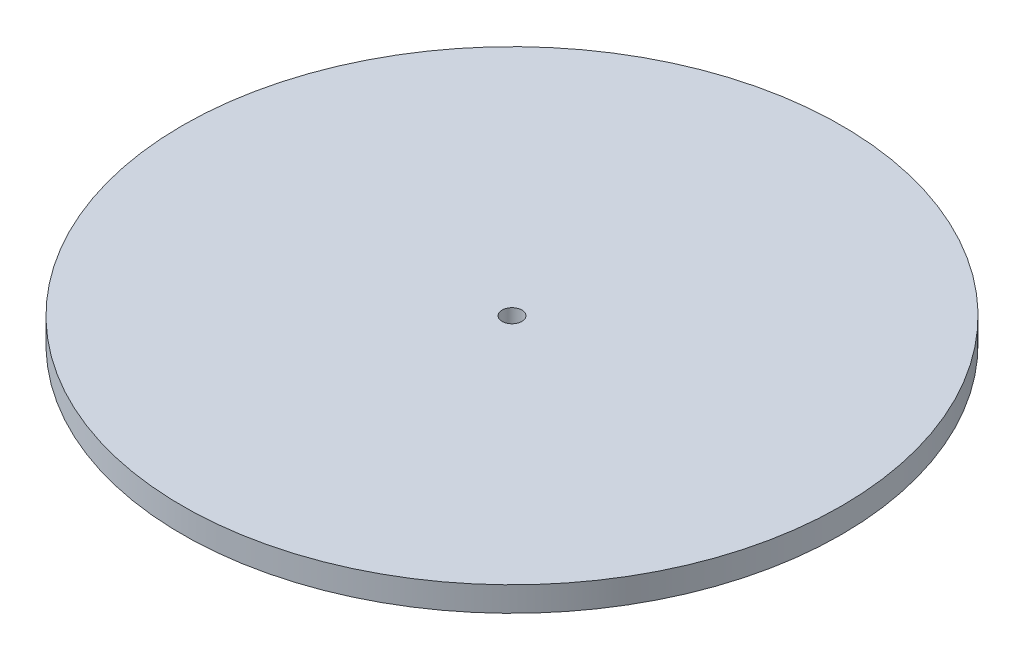
ISO-10303-21;
HEADER;
FILE_DESCRIPTION(('STEP AP214'),'2;1');
FILE_NAME('part.step','',(''),(''),'','','');
FILE_SCHEMA(('AUTOMOTIVE_DESIGN { 1 0 10303 214 1 1 1 1 }'));
ENDSEC;
DATA;
#1=APPLICATION_CONTEXT('core data for automotive mechanical design processes');
#2=APPLICATION_PROTOCOL_DEFINITION('international standard','automotive_design',2000,#1);
#3=PRODUCT_CONTEXT('',#1,'mechanical');
#4=PRODUCT('Part','Part','',(#3));
#5=PRODUCT_RELATED_PRODUCT_CATEGORY('part','',(#4));
#6=PRODUCT_DEFINITION_FORMATION('','',#4);
#7=PRODUCT_DEFINITION_CONTEXT('part definition',#1,'design');
#8=PRODUCT_DEFINITION('design','',#6,#7);
#9=PRODUCT_DEFINITION_SHAPE('','',#8);
#10=(LENGTH_UNIT() NAMED_UNIT(*) SI_UNIT(.MILLI.,.METRE.));
#11=(NAMED_UNIT(*) PLANE_ANGLE_UNIT() SI_UNIT($,.RADIAN.));
#12=(NAMED_UNIT(*) SI_UNIT($,.STERADIAN.) SOLID_ANGLE_UNIT());
#13=UNCERTAINTY_MEASURE_WITH_UNIT(LENGTH_MEASURE(1.E-05),#10,'distance_accuracy_value','');
#14=(GEOMETRIC_REPRESENTATION_CONTEXT(3) GLOBAL_UNCERTAINTY_ASSIGNED_CONTEXT((#13)) GLOBAL_UNIT_ASSIGNED_CONTEXT((#10,
#11,#12)) REPRESENTATION_CONTEXT('',''));
#15=CARTESIAN_POINT('',(0.,0.,0.));
#16=DIRECTION('',(0.,0.,1.));
#17=DIRECTION('',(1.,0.,0.));
#18=AXIS2_PLACEMENT_3D('',#15,#16,#17);
#19=CARTESIAN_POINT('',(0.,12.4782358044987,0.));
#20=DIRECTION('',(0.,1.,0.));
#21=DIRECTION('',(-1.,0.,0.));
#22=AXIS2_PLACEMENT_3D('',#19,#20,#21);
#23=CYLINDRICAL_SURFACE('',#22,40.);
#24=CARTESIAN_POINT('',(0.,12.4782358044987,0.));
#25=DIRECTION('',(0.,1.,0.));
#26=DIRECTION('',(-1.,0.,0.));
#27=AXIS2_PLACEMENT_3D('',#24,#25,#26);
#28=CIRCLE('',#27,40.);
#29=CARTESIAN_POINT('',(-40.,12.4782358044987,0.));
#30=VERTEX_POINT('',#29);
#31=EDGE_CURVE('E49',#30,#30,#28,.T.);
#32=ORIENTED_EDGE('',*,*,#31,.F.);
#33=EDGE_LOOP('',(#32));
#34=FACE_BOUND('',#33,.T.);
#35=CARTESIAN_POINT('',(0.,9.47823580449867,0.));
#36=DIRECTION('',(0.,1.,0.));
#37=DIRECTION('',(-1.,0.,0.));
#38=AXIS2_PLACEMENT_3D('',#35,#36,#37);
#39=CIRCLE('',#38,40.);
#40=CARTESIAN_POINT('',(-40.,9.47823580449867,0.));
#41=VERTEX_POINT('',#40);
#42=EDGE_CURVE('E10',#41,#41,#39,.T.);
#43=ORIENTED_EDGE('',*,*,#42,.T.);
#44=EDGE_LOOP('',(#43));
#45=FACE_BOUND('',#44,.T.);
#46=ADVANCED_FACE('F30',(#34,#45),#23,.T.);
#47=CARTESIAN_POINT('',(37.,9.47823580449867,0.));
#48=DIRECTION('',(0.,1.,0.));
#49=DIRECTION('',(-1.,0.,0.));
#50=AXIS2_PLACEMENT_3D('',#47,#48,#49);
#51=PLANE('',#50);
#52=ORIENTED_EDGE('',*,*,#42,.F.);
#53=EDGE_LOOP('',(#52));
#54=FACE_BOUND('',#53,.T.);
#55=CARTESIAN_POINT('',(0.,9.47823580449867,0.));
#56=DIRECTION('',(0.,1.,0.));
#57=DIRECTION('',(-1.,0.,0.));
#58=AXIS2_PLACEMENT_3D('',#55,#56,#57);
#59=CIRCLE('',#58,37.);
#60=CARTESIAN_POINT('',(-37.,9.47823580449867,0.));
#61=VERTEX_POINT('',#60);
#62=EDGE_CURVE('E36',#61,#61,#59,.T.);
#63=ORIENTED_EDGE('',*,*,#62,.T.);
#64=EDGE_LOOP('',(#63));
#65=FACE_BOUND('',#64,.T.);
#66=ADVANCED_FACE('F70',(#54,#65),#51,.F.);
#67=CARTESIAN_POINT('',(0.,12.4782358044987,0.));
#68=DIRECTION('',(0.,1.,0.));
#69=DIRECTION('',(-1.,0.,0.));
#70=AXIS2_PLACEMENT_3D('',#67,#68,#69);
#71=CYLINDRICAL_SURFACE('',#70,36.9999999999986);
#72=ORIENTED_EDGE('',*,*,#62,.F.);
#73=EDGE_LOOP('',(#72));
#74=FACE_BOUND('',#73,.T.);
#75=CARTESIAN_POINT('',(0.,8.47823580449791,0.));
#76=DIRECTION('',(0.,1.,0.));
#77=DIRECTION('',(-1.,0.,0.));
#78=AXIS2_PLACEMENT_3D('',#75,#76,#77);
#79=CIRCLE('',#78,36.9999999999973);
#80=CARTESIAN_POINT('',(-36.9999999999973,8.47823580449791,0.));
#81=VERTEX_POINT('',#80);
#82=EDGE_CURVE('E40',#81,#81,#79,.T.);
#83=ORIENTED_EDGE('',*,*,#82,.T.);
#84=EDGE_LOOP('',(#83));
#85=FACE_BOUND('',#84,.T.);
#86=ADVANCED_FACE('F66',(#74,#85),#71,.T.);
#87=CARTESIAN_POINT('',(-1.71989917967241E-10,0.,0.));
#88=CARTESIAN_POINT('',(4.62500000097794,0.00111706930609408,0.));
#89=CARTESIAN_POINT('',(9.25000000148261,0.607415337713683,0.));
#90=CARTESIAN_POINT('',(13.8750000012691,1.88733730452736,0.));
#91=CARTESIAN_POINT('',(18.5000000011175,3.10907285395494,0.));
#92=CARTESIAN_POINT('',(23.1250000007956,4.49061682911119,0.));
#93=CARTESIAN_POINT('',(27.7500000005231,5.82583195826899,0.));
#94=CARTESIAN_POINT('',(32.3750000002448,7.16643161010187,0.));
#95=CARTESIAN_POINT('',(36.9999999999973,8.47823580449791,0.));
#96=B_SPLINE_CURVE_WITH_KNOTS('',8,(#87,#88,#89,#90,#91,#92,#93,#94,#95),.UNSPECIFIED.,.F.,.F.,
(9,9),(0.0834027169563402,0.917429886843631),.UNSPECIFIED.);
#97=CARTESIAN_POINT('',(0.,12.4782358044987,0.));
#98=DIRECTION('',(0.,1.,0.));
#99=AXIS1_PLACEMENT('',#97,#98);
#100=SURFACE_OF_REVOLUTION('',#96,#99);
#101=CARTESIAN_POINT('',(0.,0.0181859154926144,0.));
#102=DIRECTION('',(0.,1.,0.));
#103=DIRECTION('',(-1.,0.,0.));
#104=AXIS2_PLACEMENT_3D('',#101,#102,#103);
#105=CIRCLE('',#104,1.20000000000076);
#106=CARTESIAN_POINT('',(-1.20000000000076,0.0181859154926144,0.));
#107=VERTEX_POINT('',#106);
#108=EDGE_CURVE('E52',#107,#107,#105,.T.);
#109=ORIENTED_EDGE('',*,*,#108,.T.);
#110=EDGE_LOOP('',(#109));
#111=FACE_BOUND('',#110,.T.);
#112=ORIENTED_EDGE('',*,*,#82,.F.);
#113=EDGE_LOOP('',(#112));
#114=FACE_BOUND('',#113,.T.);
#115=ADVANCED_FACE('F61',(#111,#114),#100,.T.);
#116=CARTESIAN_POINT('',(0.,12.4782358044987,0.));
#117=DIRECTION('',(0.,1.,0.));
#118=DIRECTION('',(-1.,0.,0.));
#119=AXIS2_PLACEMENT_3D('',#116,#117,#118);
#120=CYLINDRICAL_SURFACE('',#119,1.2);
#121=CARTESIAN_POINT('',(0.,12.4782358044987,0.));
#122=DIRECTION('',(0.,1.,0.));
#123=DIRECTION('',(-1.,0.,0.));
#124=AXIS2_PLACEMENT_3D('',#121,#122,#123);
#125=CIRCLE('',#124,1.2);
#126=CARTESIAN_POINT('',(-1.2,12.4782358044987,0.));
#127=VERTEX_POINT('',#126);
#128=EDGE_CURVE('E44',#127,#127,#125,.T.);
#129=ORIENTED_EDGE('',*,*,#128,.T.);
#130=EDGE_LOOP('',(#129));
#131=FACE_BOUND('',#130,.T.);
#132=ORIENTED_EDGE('',*,*,#108,.F.);
#133=EDGE_LOOP('',(#132));
#134=FACE_BOUND('',#133,.T.);
#135=ADVANCED_FACE('F65',(#131,#134),#120,.F.);
#136=CARTESIAN_POINT('',(40.,12.4782358044987,0.));
#137=DIRECTION('',(0.,-1.,0.));
#138=DIRECTION('',(1.,0.,0.));
#139=AXIS2_PLACEMENT_3D('',#136,#137,#138);
#140=PLANE('',#139);
#141=ORIENTED_EDGE('',*,*,#128,.F.);
#142=EDGE_LOOP('',(#141));
#143=FACE_BOUND('',#142,.T.);
#144=ORIENTED_EDGE('',*,*,#31,.T.);
#145=EDGE_LOOP('',(#144));
#146=FACE_BOUND('',#145,.T.);
#147=ADVANCED_FACE('F82',(#143,#146),#140,.F.);
#148=CLOSED_SHELL('',(#46,#66,#86,#115,#135,#147));
#149=MANIFOLD_SOLID_BREP('B2',#148);
#150=ADVANCED_BREP_SHAPE_REPRESENTATION('',(#18,#149),#14);
#151=SHAPE_DEFINITION_REPRESENTATION(#9,#150);
ENDSEC;
END-ISO-10303-21;
